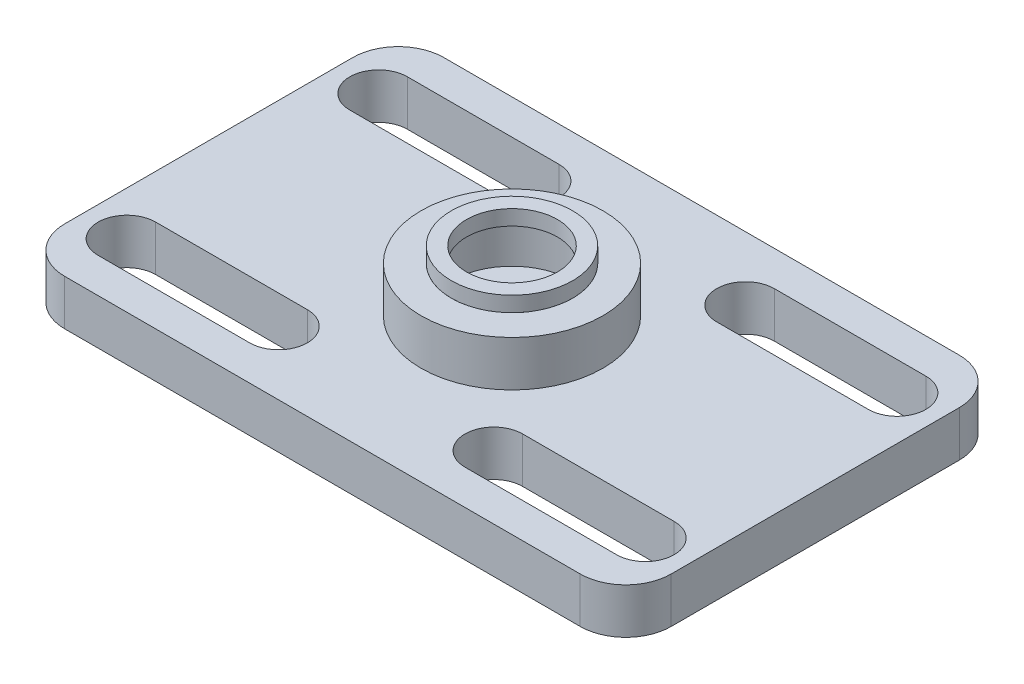
ISO-10303-21;
HEADER;
FILE_DESCRIPTION(('STEP AP214'),'2;1');
FILE_NAME('part.step','',(''),(''),'','','');
FILE_SCHEMA(('AUTOMOTIVE_DESIGN { 1 0 10303 214 1 1 1 1 }'));
ENDSEC;
DATA;
#1=APPLICATION_CONTEXT('core data for automotive mechanical design processes');
#2=APPLICATION_PROTOCOL_DEFINITION('international standard','automotive_design',2000,#1);
#3=PRODUCT_CONTEXT('',#1,'mechanical');
#4=PRODUCT('Part','Part','',(#3));
#5=PRODUCT_RELATED_PRODUCT_CATEGORY('part','',(#4));
#6=PRODUCT_DEFINITION_FORMATION('','',#4);
#7=PRODUCT_DEFINITION_CONTEXT('part definition',#1,'design');
#8=PRODUCT_DEFINITION('design','',#6,#7);
#9=PRODUCT_DEFINITION_SHAPE('','',#8);
#10=(LENGTH_UNIT() NAMED_UNIT(*) SI_UNIT(.MILLI.,.METRE.));
#11=(NAMED_UNIT(*) PLANE_ANGLE_UNIT() SI_UNIT($,.RADIAN.));
#12=(NAMED_UNIT(*) SI_UNIT($,.STERADIAN.) SOLID_ANGLE_UNIT());
#13=UNCERTAINTY_MEASURE_WITH_UNIT(LENGTH_MEASURE(1.E-05),#10,'distance_accuracy_value','');
#14=(GEOMETRIC_REPRESENTATION_CONTEXT(3) GLOBAL_UNCERTAINTY_ASSIGNED_CONTEXT((#13)) GLOBAL_UNIT_ASSIGNED_CONTEXT((#10,
#11,#12)) REPRESENTATION_CONTEXT('',''));
#15=CARTESIAN_POINT('',(0.,0.,0.));
#16=DIRECTION('',(0.,0.,1.));
#17=DIRECTION('',(1.,0.,0.));
#18=AXIS2_PLACEMENT_3D('',#15,#16,#17);
#19=CARTESIAN_POINT('',(0.,-35.,0.));
#20=DIRECTION('',(0.,-1.,0.));
#21=DIRECTION('',(0.,0.,-1.));
#22=AXIS2_PLACEMENT_3D('',#19,#20,#21);
#23=PLANE('',#22);
#24=CARTESIAN_POINT('',(85.5,-35.,-41.5));
#25=DIRECTION('',(0.,1.,0.));
#26=DIRECTION('',(0.,0.,-1.));
#27=AXIS2_PLACEMENT_3D('',#24,#25,#26);
#28=CIRCLE('',#27,9.5);
#29=CARTESIAN_POINT('',(85.5,-35.,-32.));
#30=VERTEX_POINT('',#29);
#31=CARTESIAN_POINT('',(85.5,-35.,-51.));
#32=VERTEX_POINT('',#31);
#33=EDGE_CURVE('E213',#30,#32,#28,.T.);
#34=ORIENTED_EDGE('',*,*,#33,.T.);
#35=DIRECTION('',(-1.,0.,0.));
#36=VECTOR('',#35,1.);
#37=CARTESIAN_POINT('',(85.5,-35.,-51.));
#38=LINE('',#37,#36);
#39=CARTESIAN_POINT('',(35.5,-35.,-51.));
#40=VERTEX_POINT('',#39);
#41=EDGE_CURVE('E223',#32,#40,#38,.T.);
#42=ORIENTED_EDGE('',*,*,#41,.T.);
#43=CARTESIAN_POINT('',(35.5,-35.,-41.5));
#44=DIRECTION('',(0.,1.,0.));
#45=DIRECTION('',(0.,0.,-1.));
#46=AXIS2_PLACEMENT_3D('',#43,#44,#45);
#47=CIRCLE('',#46,9.5);
#48=CARTESIAN_POINT('',(35.5,-35.,-32.));
#49=VERTEX_POINT('',#48);
#50=EDGE_CURVE('E64',#40,#49,#47,.T.);
#51=ORIENTED_EDGE('',*,*,#50,.T.);
#52=DIRECTION('',(-1.,0.,0.));
#53=VECTOR('',#52,1.);
#54=CARTESIAN_POINT('',(85.5,-35.,-32.));
#55=LINE('',#54,#53);
#56=EDGE_CURVE('E220',#30,#49,#55,.T.);
#57=ORIENTED_EDGE('',*,*,#56,.F.);
#58=EDGE_LOOP('',(#34,#42,#51,#57));
#59=FACE_BOUND('',#58,.T.);
#60=CARTESIAN_POINT('',(-85.5,-35.,41.5));
#61=DIRECTION('',(0.,1.,0.));
#62=DIRECTION('',(0.,0.,1.));
#63=AXIS2_PLACEMENT_3D('',#60,#61,#62);
#64=CIRCLE('',#63,9.5);
#65=CARTESIAN_POINT('',(-85.5,-35.,32.));
#66=VERTEX_POINT('',#65);
#67=CARTESIAN_POINT('',(-85.5,-35.,51.));
#68=VERTEX_POINT('',#67);
#69=EDGE_CURVE('E346',#66,#68,#64,.T.);
#70=ORIENTED_EDGE('',*,*,#69,.T.);
#71=DIRECTION('',(1.,0.,0.));
#72=VECTOR('',#71,1.);
#73=CARTESIAN_POINT('',(-85.5,-35.,51.));
#74=LINE('',#73,#72);
#75=CARTESIAN_POINT('',(-35.5,-35.,51.));
#76=VERTEX_POINT('',#75);
#77=EDGE_CURVE('E350',#68,#76,#74,.T.);
#78=ORIENTED_EDGE('',*,*,#77,.T.);
#79=CARTESIAN_POINT('',(-35.5,-35.,41.5));
#80=DIRECTION('',(0.,1.,0.));
#81=DIRECTION('',(0.,0.,1.));
#82=AXIS2_PLACEMENT_3D('',#79,#80,#81);
#83=CIRCLE('',#82,9.5);
#84=CARTESIAN_POINT('',(-35.5,-35.,32.));
#85=VERTEX_POINT('',#84);
#86=EDGE_CURVE('E355',#76,#85,#83,.T.);
#87=ORIENTED_EDGE('',*,*,#86,.T.);
#88=DIRECTION('',(1.,0.,0.));
#89=VECTOR('',#88,1.);
#90=CARTESIAN_POINT('',(-85.5,-35.,32.));
#91=LINE('',#90,#89);
#92=EDGE_CURVE('E359',#66,#85,#91,.T.);
#93=ORIENTED_EDGE('',*,*,#92,.F.);
#94=EDGE_LOOP('',(#70,#78,#87,#93));
#95=FACE_BOUND('',#94,.T.);
#96=DIRECTION('',(0.,0.,-1.));
#97=VECTOR('',#96,1.);
#98=CARTESIAN_POINT('',(-100.,-35.,62.5));
#99=LINE('',#98,#97);
#100=CARTESIAN_POINT('',(-100.,-35.,47.5));
#101=VERTEX_POINT('',#100);
#102=CARTESIAN_POINT('',(-100.,-35.,-47.5));
#103=VERTEX_POINT('',#102);
#104=EDGE_CURVE('E398',#101,#103,#99,.T.);
#105=ORIENTED_EDGE('',*,*,#104,.T.);
#106=CARTESIAN_POINT('',(-85.,-35.,-47.5));
#107=DIRECTION('',(0.,-1.,0.));
#108=DIRECTION('',(0.,0.,-1.));
#109=AXIS2_PLACEMENT_3D('',#106,#107,#108);
#110=CIRCLE('',#109,15.);
#111=CARTESIAN_POINT('',(-85.,-35.,-62.5));
#112=VERTEX_POINT('',#111);
#113=EDGE_CURVE('E471',#103,#112,#110,.T.);
#114=ORIENTED_EDGE('',*,*,#113,.T.);
#115=DIRECTION('',(1.,0.,0.));
#116=VECTOR('',#115,1.);
#117=CARTESIAN_POINT('',(-100.,-35.,-62.5));
#118=LINE('',#117,#116);
#119=CARTESIAN_POINT('',(85.,-35.,-62.5));
#120=VERTEX_POINT('',#119);
#121=EDGE_CURVE('E402',#112,#120,#118,.T.);
#122=ORIENTED_EDGE('',*,*,#121,.T.);
#123=CARTESIAN_POINT('',(85.,-35.,-47.5));
#124=DIRECTION('',(0.,-1.,0.));
#125=DIRECTION('',(0.,0.,-1.));
#126=AXIS2_PLACEMENT_3D('',#123,#124,#125);
#127=CIRCLE('',#126,15.);
#128=CARTESIAN_POINT('',(100.,-35.,-47.5));
#129=VERTEX_POINT('',#128);
#130=EDGE_CURVE('E465',#120,#129,#127,.T.);
#131=ORIENTED_EDGE('',*,*,#130,.T.);
#132=DIRECTION('',(0.,0.,1.));
#133=VECTOR('',#132,1.);
#134=CARTESIAN_POINT('',(100.,-35.,62.5));
#135=LINE('',#134,#133);
#136=CARTESIAN_POINT('',(100.,-35.,47.5));
#137=VERTEX_POINT('',#136);
#138=EDGE_CURVE('E389',#129,#137,#135,.T.);
#139=ORIENTED_EDGE('',*,*,#138,.T.);
#140=CARTESIAN_POINT('',(85.,-35.,47.5));
#141=DIRECTION('',(0.,-1.,0.));
#142=DIRECTION('',(0.,0.,-1.));
#143=AXIS2_PLACEMENT_3D('',#140,#141,#142);
#144=CIRCLE('',#143,15.);
#145=CARTESIAN_POINT('',(85.,-35.,62.5));
#146=VERTEX_POINT('',#145);
#147=EDGE_CURVE('E462',#137,#146,#144,.T.);
#148=ORIENTED_EDGE('',*,*,#147,.T.);
#149=DIRECTION('',(-1.,0.,0.));
#150=VECTOR('',#149,1.);
#151=CARTESIAN_POINT('',(-100.,-35.,62.5));
#152=LINE('',#151,#150);
#153=CARTESIAN_POINT('',(-85.,-35.,62.5));
#154=VERTEX_POINT('',#153);
#155=EDGE_CURVE('E393',#146,#154,#152,.T.);
#156=ORIENTED_EDGE('',*,*,#155,.T.);
#157=CARTESIAN_POINT('',(-85.,-35.,47.5));
#158=DIRECTION('',(0.,-1.,0.));
#159=DIRECTION('',(0.,0.,-1.));
#160=AXIS2_PLACEMENT_3D('',#157,#158,#159);
#161=CIRCLE('',#160,15.);
#162=EDGE_CURVE('E468',#154,#101,#161,.T.);
#163=ORIENTED_EDGE('',*,*,#162,.T.);
#164=EDGE_LOOP('',(#105,#114,#122,#131,#139,#148,#156,#163));
#165=FACE_BOUND('',#164,.T.);
#166=DIRECTION('',(1.,0.,0.));
#167=VECTOR('',#166,1.);
#168=CARTESIAN_POINT('',(-85.5,-35.,-51.));
#169=LINE('',#168,#167);
#170=CARTESIAN_POINT('',(-85.5,-35.,-51.));
#171=VERTEX_POINT('',#170);
#172=CARTESIAN_POINT('',(-35.5,-35.,-51.));
#173=VERTEX_POINT('',#172);
#174=EDGE_CURVE('E314',#171,#173,#169,.T.);
#175=ORIENTED_EDGE('',*,*,#174,.F.);
#176=CARTESIAN_POINT('',(-85.5,-35.,-41.5));
#177=DIRECTION('',(0.,-1.,0.));
#178=DIRECTION('',(0.,0.,-1.));
#179=AXIS2_PLACEMENT_3D('',#176,#177,#178);
#180=CIRCLE('',#179,9.5);
#181=CARTESIAN_POINT('',(-85.5,-35.,-32.));
#182=VERTEX_POINT('',#181);
#183=EDGE_CURVE('E302',#182,#171,#180,.T.);
#184=ORIENTED_EDGE('',*,*,#183,.F.);
#185=DIRECTION('',(1.,0.,0.));
#186=VECTOR('',#185,1.);
#187=CARTESIAN_POINT('',(-85.5,-35.,-32.));
#188=LINE('',#187,#186);
#189=CARTESIAN_POINT('',(-35.5,-35.,-32.));
#190=VERTEX_POINT('',#189);
#191=EDGE_CURVE('E305',#182,#190,#188,.T.);
#192=ORIENTED_EDGE('',*,*,#191,.T.);
#193=CARTESIAN_POINT('',(-35.5,-35.,-41.5));
#194=DIRECTION('',(0.,-1.,0.));
#195=DIRECTION('',(0.,0.,-1.));
#196=AXIS2_PLACEMENT_3D('',#193,#194,#195);
#197=CIRCLE('',#196,9.5);
#198=EDGE_CURVE('E310',#173,#190,#197,.T.);
#199=ORIENTED_EDGE('',*,*,#198,.F.);
#200=EDGE_LOOP('',(#175,#184,#192,#199));
#201=FACE_BOUND('',#200,.T.);
#202=DIRECTION('',(-1.,0.,0.));
#203=VECTOR('',#202,1.);
#204=CARTESIAN_POINT('',(85.5,-35.,51.));
#205=LINE('',#204,#203);
#206=CARTESIAN_POINT('',(85.5,-35.,51.));
#207=VERTEX_POINT('',#206);
#208=CARTESIAN_POINT('',(35.5,-35.,51.));
#209=VERTEX_POINT('',#208);
#210=EDGE_CURVE('E270',#207,#209,#205,.T.);
#211=ORIENTED_EDGE('',*,*,#210,.F.);
#212=CARTESIAN_POINT('',(85.5,-35.,41.5));
#213=DIRECTION('',(0.,-1.,0.));
#214=DIRECTION('',(0.,0.,1.));
#215=AXIS2_PLACEMENT_3D('',#212,#213,#214);
#216=CIRCLE('',#215,9.5);
#217=CARTESIAN_POINT('',(85.5,-35.,32.));
#218=VERTEX_POINT('',#217);
#219=EDGE_CURVE('E258',#218,#207,#216,.T.);
#220=ORIENTED_EDGE('',*,*,#219,.F.);
#221=DIRECTION('',(-1.,0.,0.));
#222=VECTOR('',#221,1.);
#223=CARTESIAN_POINT('',(85.5,-35.,32.));
#224=LINE('',#223,#222);
#225=CARTESIAN_POINT('',(35.5,-35.,32.));
#226=VERTEX_POINT('',#225);
#227=EDGE_CURVE('E261',#218,#226,#224,.T.);
#228=ORIENTED_EDGE('',*,*,#227,.T.);
#229=CARTESIAN_POINT('',(35.5,-35.,41.5));
#230=DIRECTION('',(0.,-1.,0.));
#231=DIRECTION('',(0.,0.,1.));
#232=AXIS2_PLACEMENT_3D('',#229,#230,#231);
#233=CIRCLE('',#232,9.5);
#234=EDGE_CURVE('E266',#209,#226,#233,.T.);
#235=ORIENTED_EDGE('',*,*,#234,.F.);
#236=EDGE_LOOP('',(#211,#220,#228,#235));
#237=FACE_BOUND('',#236,.T.);
#238=ADVANCED_FACE('F48',(#59,#95,#165,#201,#237),#23,.T.);
#239=CARTESIAN_POINT('',(0.,-20.,0.));
#240=DIRECTION('',(0.,-1.,0.));
#241=DIRECTION('',(0.,0.,-1.));
#242=AXIS2_PLACEMENT_3D('',#239,#240,#241);
#243=PLANE('',#242);
#244=DIRECTION('',(-1.,0.,0.));
#245=VECTOR('',#244,1.);
#246=CARTESIAN_POINT('',(85.5,-20.,-51.));
#247=LINE('',#246,#245);
#248=CARTESIAN_POINT('',(85.5,-20.,-51.));
#249=VERTEX_POINT('',#248);
#250=CARTESIAN_POINT('',(35.5,-20.,-51.));
#251=VERTEX_POINT('',#250);
#252=EDGE_CURVE('E243',#249,#251,#247,.T.);
#253=ORIENTED_EDGE('',*,*,#252,.F.);
#254=CARTESIAN_POINT('',(85.5,-20.,-41.5));
#255=DIRECTION('',(0.,1.,0.));
#256=DIRECTION('',(0.,0.,-1.));
#257=AXIS2_PLACEMENT_3D('',#254,#255,#256);
#258=CIRCLE('',#257,9.5);
#259=CARTESIAN_POINT('',(85.5,-20.,-32.));
#260=VERTEX_POINT('',#259);
#261=EDGE_CURVE('E72',#260,#249,#258,.T.);
#262=ORIENTED_EDGE('',*,*,#261,.F.);
#263=DIRECTION('',(-1.,0.,0.));
#264=VECTOR('',#263,1.);
#265=CARTESIAN_POINT('',(85.5,-20.,-32.));
#266=LINE('',#265,#264);
#267=CARTESIAN_POINT('',(35.5,-20.,-32.));
#268=VERTEX_POINT('',#267);
#269=EDGE_CURVE('E230',#260,#268,#266,.T.);
#270=ORIENTED_EDGE('',*,*,#269,.T.);
#271=CARTESIAN_POINT('',(35.5,-20.,-41.5));
#272=DIRECTION('',(0.,1.,0.));
#273=DIRECTION('',(0.,0.,-1.));
#274=AXIS2_PLACEMENT_3D('',#271,#272,#273);
#275=CIRCLE('',#274,9.5);
#276=EDGE_CURVE('E234',#251,#268,#275,.T.);
#277=ORIENTED_EDGE('',*,*,#276,.F.);
#278=EDGE_LOOP('',(#253,#262,#270,#277));
#279=FACE_BOUND('',#278,.T.);
#280=CARTESIAN_POINT('',(-85.5,-20.,-41.5));
#281=DIRECTION('',(0.,-1.,0.));
#282=DIRECTION('',(0.,0.,-1.));
#283=AXIS2_PLACEMENT_3D('',#280,#281,#282);
#284=CIRCLE('',#283,9.5);
#285=CARTESIAN_POINT('',(-85.5,-20.,-32.));
#286=VERTEX_POINT('',#285);
#287=CARTESIAN_POINT('',(-85.5,-20.,-51.));
#288=VERTEX_POINT('',#287);
#289=EDGE_CURVE('E292',#286,#288,#284,.T.);
#290=ORIENTED_EDGE('',*,*,#289,.T.);
#291=DIRECTION('',(1.,0.,0.));
#292=VECTOR('',#291,1.);
#293=CARTESIAN_POINT('',(-85.5,-20.,-51.));
#294=LINE('',#293,#292);
#295=CARTESIAN_POINT('',(-35.5,-20.,-51.));
#296=VERTEX_POINT('',#295);
#297=EDGE_CURVE('E306',#288,#296,#294,.T.);
#298=ORIENTED_EDGE('',*,*,#297,.T.);
#299=CARTESIAN_POINT('',(-35.5,-20.,-41.5));
#300=DIRECTION('',(0.,-1.,0.));
#301=DIRECTION('',(0.,0.,-1.));
#302=AXIS2_PLACEMENT_3D('',#299,#300,#301);
#303=CIRCLE('',#302,9.5);
#304=CARTESIAN_POINT('',(-35.5,-20.,-32.));
#305=VERTEX_POINT('',#304);
#306=EDGE_CURVE('E325',#296,#305,#303,.T.);
#307=ORIENTED_EDGE('',*,*,#306,.T.);
#308=DIRECTION('',(1.,0.,0.));
#309=VECTOR('',#308,1.);
#310=CARTESIAN_POINT('',(-85.5,-20.,-32.));
#311=LINE('',#310,#309);
#312=EDGE_CURVE('E321',#286,#305,#311,.T.);
#313=ORIENTED_EDGE('',*,*,#312,.F.);
#314=EDGE_LOOP('',(#290,#298,#307,#313));
#315=FACE_BOUND('',#314,.T.);
#316=DIRECTION('',(1.,0.,0.));
#317=VECTOR('',#316,1.);
#318=CARTESIAN_POINT('',(-85.5,-20.,51.));
#319=LINE('',#318,#317);
#320=CARTESIAN_POINT('',(-85.5,-20.,51.));
#321=VERTEX_POINT('',#320);
#322=CARTESIAN_POINT('',(-35.5,-20.,51.));
#323=VERTEX_POINT('',#322);
#324=EDGE_CURVE('E365',#321,#323,#319,.T.);
#325=ORIENTED_EDGE('',*,*,#324,.F.);
#326=CARTESIAN_POINT('',(-85.5,-20.,41.5));
#327=DIRECTION('',(0.,1.,0.));
#328=DIRECTION('',(0.,0.,1.));
#329=AXIS2_PLACEMENT_3D('',#326,#327,#328);
#330=CIRCLE('',#329,9.5);
#331=CARTESIAN_POINT('',(-85.5,-20.,32.));
#332=VERTEX_POINT('',#331);
#333=EDGE_CURVE('E336',#332,#321,#330,.T.);
#334=ORIENTED_EDGE('',*,*,#333,.F.);
#335=DIRECTION('',(1.,0.,0.));
#336=VECTOR('',#335,1.);
#337=CARTESIAN_POINT('',(-85.5,-20.,32.));
#338=LINE('',#337,#336);
#339=CARTESIAN_POINT('',(-35.5,-20.,32.));
#340=VERTEX_POINT('',#339);
#341=EDGE_CURVE('E351',#332,#340,#338,.T.);
#342=ORIENTED_EDGE('',*,*,#341,.T.);
#343=CARTESIAN_POINT('',(-35.5,-20.,41.5));
#344=DIRECTION('',(0.,1.,0.));
#345=DIRECTION('',(0.,0.,1.));
#346=AXIS2_PLACEMENT_3D('',#343,#344,#345);
#347=CIRCLE('',#346,9.5);
#348=EDGE_CURVE('E369',#323,#340,#347,.T.);
#349=ORIENTED_EDGE('',*,*,#348,.F.);
#350=EDGE_LOOP('',(#325,#334,#342,#349));
#351=FACE_BOUND('',#350,.T.);
#352=CARTESIAN_POINT('',(0.,-20.,0.));
#353=DIRECTION('',(0.,-1.,0.));
#354=DIRECTION('',(0.,0.,-1.));
#355=AXIS2_PLACEMENT_3D('',#352,#353,#354);
#356=CIRCLE('',#355,30.);
#357=CARTESIAN_POINT('',(0.,-20.,-30.));
#358=VERTEX_POINT('',#357);
#359=EDGE_CURVE('E429',#358,#358,#356,.T.);
#360=ORIENTED_EDGE('',*,*,#359,.T.);
#361=EDGE_LOOP('',(#360));
#362=FACE_BOUND('',#361,.T.);
#363=DIRECTION('',(1.,0.,0.));
#364=VECTOR('',#363,1.);
#365=CARTESIAN_POINT('',(-100.,-20.,-62.5));
#366=LINE('',#365,#364);
#367=CARTESIAN_POINT('',(-85.,-20.,-62.5));
#368=VERTEX_POINT('',#367);
#369=CARTESIAN_POINT('',(85.,-20.,-62.5));
#370=VERTEX_POINT('',#369);
#371=EDGE_CURVE('E394',#368,#370,#366,.T.);
#372=ORIENTED_EDGE('',*,*,#371,.F.);
#373=CARTESIAN_POINT('',(-85.,-20.,-47.5));
#374=DIRECTION('',(0.,-1.,0.));
#375=DIRECTION('',(0.,0.,-1.));
#376=AXIS2_PLACEMENT_3D('',#373,#374,#375);
#377=CIRCLE('',#376,15.);
#378=CARTESIAN_POINT('',(-100.,-20.,-47.5));
#379=VERTEX_POINT('',#378);
#380=EDGE_CURVE('E452',#368,#379,#377,.F.);
#381=ORIENTED_EDGE('',*,*,#380,.T.);
#382=DIRECTION('',(0.,0.,-1.));
#383=VECTOR('',#382,1.);
#384=CARTESIAN_POINT('',(-100.,-20.,62.5));
#385=LINE('',#384,#383);
#386=CARTESIAN_POINT('',(-100.,-20.,47.5));
#387=VERTEX_POINT('',#386);
#388=EDGE_CURVE('E414',#387,#379,#385,.T.);
#389=ORIENTED_EDGE('',*,*,#388,.F.);
#390=CARTESIAN_POINT('',(-85.,-20.,47.5));
#391=DIRECTION('',(0.,-1.,0.));
#392=DIRECTION('',(0.,0.,-1.));
#393=AXIS2_PLACEMENT_3D('',#390,#391,#392);
#394=CIRCLE('',#393,15.);
#395=CARTESIAN_POINT('',(-85.,-20.,62.5));
#396=VERTEX_POINT('',#395);
#397=EDGE_CURVE('E449',#387,#396,#394,.F.);
#398=ORIENTED_EDGE('',*,*,#397,.T.);
#399=DIRECTION('',(-1.,0.,0.));
#400=VECTOR('',#399,1.);
#401=CARTESIAN_POINT('',(-100.,-20.,62.5));
#402=LINE('',#401,#400);
#403=CARTESIAN_POINT('',(85.,-20.,62.5));
#404=VERTEX_POINT('',#403);
#405=EDGE_CURVE('E410',#404,#396,#402,.T.);
#406=ORIENTED_EDGE('',*,*,#405,.F.);
#407=CARTESIAN_POINT('',(85.,-20.,47.5));
#408=DIRECTION('',(0.,-1.,0.));
#409=DIRECTION('',(0.,0.,-1.));
#410=AXIS2_PLACEMENT_3D('',#407,#408,#409);
#411=CIRCLE('',#410,15.);
#412=CARTESIAN_POINT('',(100.,-20.,47.5));
#413=VERTEX_POINT('',#412);
#414=EDGE_CURVE('E443',#404,#413,#411,.F.);
#415=ORIENTED_EDGE('',*,*,#414,.T.);
#416=DIRECTION('',(0.,0.,1.));
#417=VECTOR('',#416,1.);
#418=CARTESIAN_POINT('',(100.,-20.,62.5));
#419=LINE('',#418,#417);
#420=CARTESIAN_POINT('',(100.,-20.,-47.5));
#421=VERTEX_POINT('',#420);
#422=EDGE_CURVE('E379',#421,#413,#419,.T.);
#423=ORIENTED_EDGE('',*,*,#422,.F.);
#424=CARTESIAN_POINT('',(85.,-20.,-47.5));
#425=DIRECTION('',(0.,-1.,0.));
#426=DIRECTION('',(0.,0.,-1.));
#427=AXIS2_PLACEMENT_3D('',#424,#425,#426);
#428=CIRCLE('',#427,15.);
#429=EDGE_CURVE('E446',#421,#370,#428,.F.);
#430=ORIENTED_EDGE('',*,*,#429,.T.);
#431=EDGE_LOOP('',(#372,#381,#389,#398,#406,#415,#423,#430));
#432=FACE_BOUND('',#431,.T.);
#433=CARTESIAN_POINT('',(85.5,-20.,41.5));
#434=DIRECTION('',(0.,-1.,0.));
#435=DIRECTION('',(0.,0.,1.));
#436=AXIS2_PLACEMENT_3D('',#433,#434,#435);
#437=CIRCLE('',#436,9.5);
#438=CARTESIAN_POINT('',(85.5,-20.,32.));
#439=VERTEX_POINT('',#438);
#440=CARTESIAN_POINT('',(85.5,-20.,51.));
#441=VERTEX_POINT('',#440);
#442=EDGE_CURVE('E252',#439,#441,#437,.T.);
#443=ORIENTED_EDGE('',*,*,#442,.T.);
#444=DIRECTION('',(-1.,0.,0.));
#445=VECTOR('',#444,1.);
#446=CARTESIAN_POINT('',(85.5,-20.,51.));
#447=LINE('',#446,#445);
#448=CARTESIAN_POINT('',(35.5,-20.,51.));
#449=VERTEX_POINT('',#448);
#450=EDGE_CURVE('E262',#441,#449,#447,.T.);
#451=ORIENTED_EDGE('',*,*,#450,.T.);
#452=CARTESIAN_POINT('',(35.5,-20.,41.5));
#453=DIRECTION('',(0.,-1.,0.));
#454=DIRECTION('',(0.,0.,1.));
#455=AXIS2_PLACEMENT_3D('',#452,#453,#454);
#456=CIRCLE('',#455,9.5);
#457=CARTESIAN_POINT('',(35.5,-20.,32.));
#458=VERTEX_POINT('',#457);
#459=EDGE_CURVE('E281',#449,#458,#456,.T.);
#460=ORIENTED_EDGE('',*,*,#459,.T.);
#461=DIRECTION('',(-1.,0.,0.));
#462=VECTOR('',#461,1.);
#463=CARTESIAN_POINT('',(85.5,-20.,32.));
#464=LINE('',#463,#462);
#465=EDGE_CURVE('E277',#439,#458,#464,.T.);
#466=ORIENTED_EDGE('',*,*,#465,.F.);
#467=EDGE_LOOP('',(#443,#451,#460,#466));
#468=FACE_BOUND('',#467,.T.);
#469=ADVANCED_FACE('F500',(#279,#315,#351,#362,#432,#468),#243,.F.);
#470=CARTESIAN_POINT('',(0.,-5.,0.));
#471=DIRECTION('',(0.,-1.,0.));
#472=DIRECTION('',(0.,0.,-1.));
#473=AXIS2_PLACEMENT_3D('',#470,#471,#472);
#474=PLANE('',#473);
#475=CARTESIAN_POINT('',(0.,-5.,0.));
#476=DIRECTION('',(0.,-1.,0.));
#477=DIRECTION('',(0.,0.,-1.));
#478=AXIS2_PLACEMENT_3D('',#475,#476,#477);
#479=CIRCLE('',#478,30.);
#480=CARTESIAN_POINT('',(0.,-5.,-30.));
#481=VERTEX_POINT('',#480);
#482=EDGE_CURVE('E428',#481,#481,#479,.T.);
#483=ORIENTED_EDGE('',*,*,#482,.F.);
#484=EDGE_LOOP('',(#483));
#485=FACE_BOUND('',#484,.T.);
#486=CARTESIAN_POINT('',(0.,-5.,0.));
#487=DIRECTION('',(0.,-1.,0.));
#488=DIRECTION('',(0.,0.,-1.));
#489=AXIS2_PLACEMENT_3D('',#486,#487,#488);
#490=CIRCLE('',#489,20.);
#491=CARTESIAN_POINT('',(0.,-5.,-20.));
#492=VERTEX_POINT('',#491);
#493=EDGE_CURVE('E424',#492,#492,#490,.T.);
#494=ORIENTED_EDGE('',*,*,#493,.T.);
#495=EDGE_LOOP('',(#494));
#496=FACE_BOUND('',#495,.T.);
#497=ADVANCED_FACE('F534',(#485,#496),#474,.F.);
#498=CARTESIAN_POINT('',(0.,-20.,0.));
#499=DIRECTION('',(0.,1.,0.));
#500=DIRECTION('',(0.,0.,1.));
#501=AXIS2_PLACEMENT_3D('',#498,#499,#500);
#502=CYLINDRICAL_SURFACE('',#501,30.);
#503=ORIENTED_EDGE('',*,*,#359,.F.);
#504=EDGE_LOOP('',(#503));
#505=FACE_BOUND('',#504,.T.);
#506=ORIENTED_EDGE('',*,*,#482,.T.);
#507=EDGE_LOOP('',(#506));
#508=FACE_BOUND('',#507,.T.);
#509=ADVANCED_FACE('F552',(#505,#508),#502,.T.);
#510=CARTESIAN_POINT('',(0.,-20.,0.));
#511=DIRECTION('',(0.,1.,0.));
#512=DIRECTION('',(0.,0.,1.));
#513=AXIS2_PLACEMENT_3D('',#510,#511,#512);
#514=CYLINDRICAL_SURFACE('',#513,20.);
#515=CARTESIAN_POINT('',(0.,-20.,0.));
#516=DIRECTION('',(0.,-1.,0.));
#517=DIRECTION('',(0.,0.,-1.));
#518=AXIS2_PLACEMENT_3D('',#515,#516,#517);
#519=CIRCLE('',#518,20.);
#520=CARTESIAN_POINT('',(0.,-20.,-20.));
#521=VERTEX_POINT('',#520);
#522=EDGE_CURVE('E406',#521,#521,#519,.T.);
#523=ORIENTED_EDGE('',*,*,#522,.T.);
#524=EDGE_LOOP('',(#523));
#525=FACE_BOUND('',#524,.T.);
#526=ORIENTED_EDGE('',*,*,#493,.F.);
#527=EDGE_LOOP('',(#526));
#528=FACE_BOUND('',#527,.T.);
#529=ADVANCED_FACE('F549',(#525,#528),#514,.F.);
#530=ORIENTED_EDGE('',*,*,#522,.F.);
#531=EDGE_LOOP('',(#530));
#532=FACE_BOUND('',#531,.T.);
#533=ADVANCED_FACE('F537',(#532),#243,.F.);
#534=CARTESIAN_POINT('',(100.,-35.,62.5));
#535=DIRECTION('',(-1.,0.,0.));
#536=DIRECTION('',(0.,0.,1.));
#537=AXIS2_PLACEMENT_3D('',#534,#535,#536);
#538=PLANE('',#537);
#539=ORIENTED_EDGE('',*,*,#138,.F.);
#540=DIRECTION('',(0.,1.,0.));
#541=VECTOR('',#540,1.);
#542=CARTESIAN_POINT('',(100.,-35.,-47.5));
#543=LINE('',#542,#541);
#544=EDGE_CURVE('E12',#129,#421,#543,.T.);
#545=ORIENTED_EDGE('',*,*,#544,.T.);
#546=ORIENTED_EDGE('',*,*,#422,.T.);
#547=DIRECTION('',(0.,1.,0.));
#548=VECTOR('',#547,1.);
#549=CARTESIAN_POINT('',(100.,-35.,47.5));
#550=LINE('',#549,#548);
#551=EDGE_CURVE('E57',#413,#137,#550,.F.);
#552=ORIENTED_EDGE('',*,*,#551,.T.);
#553=EDGE_LOOP('',(#539,#545,#546,#552));
#554=FACE_BOUND('',#553,.T.);
#555=ADVANCED_FACE('F484',(#554),#538,.F.);
#556=CARTESIAN_POINT('',(-100.,-35.,62.5));
#557=DIRECTION('',(0.,0.,-1.));
#558=DIRECTION('',(-1.,0.,0.));
#559=AXIS2_PLACEMENT_3D('',#556,#557,#558);
#560=PLANE('',#559);
#561=ORIENTED_EDGE('',*,*,#405,.T.);
#562=DIRECTION('',(0.,1.,0.));
#563=VECTOR('',#562,1.);
#564=CARTESIAN_POINT('',(-85.,-35.,62.5));
#565=LINE('',#564,#563);
#566=EDGE_CURVE('E478',#396,#154,#565,.F.);
#567=ORIENTED_EDGE('',*,*,#566,.T.);
#568=ORIENTED_EDGE('',*,*,#155,.F.);
#569=DIRECTION('',(0.,1.,0.));
#570=VECTOR('',#569,1.);
#571=CARTESIAN_POINT('',(85.,-35.,62.5));
#572=LINE('',#571,#570);
#573=EDGE_CURVE('E474',#146,#404,#572,.T.);
#574=ORIENTED_EDGE('',*,*,#573,.T.);
#575=EDGE_LOOP('',(#561,#567,#568,#574));
#576=FACE_BOUND('',#575,.T.);
#577=ADVANCED_FACE('F496',(#576),#560,.F.);
#578=CARTESIAN_POINT('',(-100.,-35.,62.5));
#579=DIRECTION('',(1.,0.,0.));
#580=DIRECTION('',(0.,0.,-1.));
#581=AXIS2_PLACEMENT_3D('',#578,#579,#580);
#582=PLANE('',#581);
#583=ORIENTED_EDGE('',*,*,#388,.T.);
#584=DIRECTION('',(0.,1.,0.));
#585=VECTOR('',#584,1.);
#586=CARTESIAN_POINT('',(-100.,-35.,-47.5));
#587=LINE('',#586,#585);
#588=EDGE_CURVE('E459',#379,#103,#587,.F.);
#589=ORIENTED_EDGE('',*,*,#588,.T.);
#590=ORIENTED_EDGE('',*,*,#104,.F.);
#591=DIRECTION('',(0.,1.,0.));
#592=VECTOR('',#591,1.);
#593=CARTESIAN_POINT('',(-100.,-35.,47.5));
#594=LINE('',#593,#592);
#595=EDGE_CURVE('E455',#101,#387,#594,.T.);
#596=ORIENTED_EDGE('',*,*,#595,.T.);
#597=EDGE_LOOP('',(#583,#589,#590,#596));
#598=FACE_BOUND('',#597,.T.);
#599=ADVANCED_FACE('F509',(#598),#582,.F.);
#600=CARTESIAN_POINT('',(-100.,-35.,-62.5));
#601=DIRECTION('',(0.,0.,1.));
#602=DIRECTION('',(1.,0.,0.));
#603=AXIS2_PLACEMENT_3D('',#600,#601,#602);
#604=PLANE('',#603);
#605=ORIENTED_EDGE('',*,*,#121,.F.);
#606=DIRECTION('',(0.,1.,0.));
#607=VECTOR('',#606,1.);
#608=CARTESIAN_POINT('',(-85.,-35.,-62.5));
#609=LINE('',#608,#607);
#610=EDGE_CURVE('E439',#112,#368,#609,.T.);
#611=ORIENTED_EDGE('',*,*,#610,.T.);
#612=ORIENTED_EDGE('',*,*,#371,.T.);
#613=DIRECTION('',(0.,1.,0.));
#614=VECTOR('',#613,1.);
#615=CARTESIAN_POINT('',(85.,-35.,-62.5));
#616=LINE('',#615,#614);
#617=EDGE_CURVE('E433',#370,#120,#616,.F.);
#618=ORIENTED_EDGE('',*,*,#617,.T.);
#619=EDGE_LOOP('',(#605,#611,#612,#618));
#620=FACE_BOUND('',#619,.T.);
#621=ADVANCED_FACE('F517',(#620),#604,.F.);
#622=CARTESIAN_POINT('',(-85.,-35.,-47.5));
#623=DIRECTION('',(0.,1.,0.));
#624=DIRECTION('',(0.,0.,1.));
#625=AXIS2_PLACEMENT_3D('',#622,#623,#624);
#626=CYLINDRICAL_SURFACE('',#625,15.);
#627=ORIENTED_EDGE('',*,*,#113,.F.);
#628=ORIENTED_EDGE('',*,*,#588,.F.);
#629=ORIENTED_EDGE('',*,*,#380,.F.);
#630=ORIENTED_EDGE('',*,*,#610,.F.);
#631=EDGE_LOOP('',(#627,#628,#629,#630));
#632=FACE_BOUND('',#631,.T.);
#633=ADVANCED_FACE('F515',(#632),#626,.T.);
#634=CARTESIAN_POINT('',(-85.,-35.,47.5));
#635=DIRECTION('',(0.,1.,0.));
#636=DIRECTION('',(0.,0.,1.));
#637=AXIS2_PLACEMENT_3D('',#634,#635,#636);
#638=CYLINDRICAL_SURFACE('',#637,15.);
#639=ORIENTED_EDGE('',*,*,#162,.F.);
#640=ORIENTED_EDGE('',*,*,#566,.F.);
#641=ORIENTED_EDGE('',*,*,#397,.F.);
#642=ORIENTED_EDGE('',*,*,#595,.F.);
#643=EDGE_LOOP('',(#639,#640,#641,#642));
#644=FACE_BOUND('',#643,.T.);
#645=ADVANCED_FACE('F506',(#644),#638,.T.);
#646=CARTESIAN_POINT('',(85.,-35.,-47.5));
#647=DIRECTION('',(0.,1.,0.));
#648=DIRECTION('',(0.,0.,1.));
#649=AXIS2_PLACEMENT_3D('',#646,#647,#648);
#650=CYLINDRICAL_SURFACE('',#649,15.);
#651=ORIENTED_EDGE('',*,*,#130,.F.);
#652=ORIENTED_EDGE('',*,*,#617,.F.);
#653=ORIENTED_EDGE('',*,*,#429,.F.);
#654=ORIENTED_EDGE('',*,*,#544,.F.);
#655=EDGE_LOOP('',(#651,#652,#653,#654));
#656=FACE_BOUND('',#655,.T.);
#657=ADVANCED_FACE('F520',(#656),#650,.T.);
#658=CARTESIAN_POINT('',(85.,-35.,47.5));
#659=DIRECTION('',(0.,1.,0.));
#660=DIRECTION('',(0.,0.,1.));
#661=AXIS2_PLACEMENT_3D('',#658,#659,#660);
#662=CYLINDRICAL_SURFACE('',#661,15.);
#663=ORIENTED_EDGE('',*,*,#147,.F.);
#664=ORIENTED_EDGE('',*,*,#551,.F.);
#665=ORIENTED_EDGE('',*,*,#414,.F.);
#666=ORIENTED_EDGE('',*,*,#573,.F.);
#667=EDGE_LOOP('',(#663,#664,#665,#666));
#668=FACE_BOUND('',#667,.T.);
#669=ADVANCED_FACE('F50',(#668),#662,.T.);
#670=CARTESIAN_POINT('',(-85.5,-35.,41.5));
#671=DIRECTION('',(0.,1.,0.));
#672=DIRECTION('',(0.,0.,1.));
#673=AXIS2_PLACEMENT_3D('',#670,#671,#672);
#674=CYLINDRICAL_SURFACE('',#673,9.5);
#675=ORIENTED_EDGE('',*,*,#333,.T.);
#676=DIRECTION('',(0.,1.,0.));
#677=VECTOR('',#676,1.);
#678=CARTESIAN_POINT('',(-85.5,-35.,51.));
#679=LINE('',#678,#677);
#680=EDGE_CURVE('E362',#68,#321,#679,.T.);
#681=ORIENTED_EDGE('',*,*,#680,.F.);
#682=ORIENTED_EDGE('',*,*,#69,.F.);
#683=DIRECTION('',(0.,1.,0.));
#684=VECTOR('',#683,1.);
#685=CARTESIAN_POINT('',(-85.5,-35.,32.));
#686=LINE('',#685,#684);
#687=EDGE_CURVE('E376',#66,#332,#686,.T.);
#688=ORIENTED_EDGE('',*,*,#687,.T.);
#689=EDGE_LOOP('',(#675,#681,#682,#688));
#690=FACE_BOUND('',#689,.T.);
#691=ADVANCED_FACE('F526',(#690),#674,.F.);
#692=CARTESIAN_POINT('',(-85.5,-35.,32.));
#693=DIRECTION('',(0.,0.,1.));
#694=DIRECTION('',(1.,0.,0.));
#695=AXIS2_PLACEMENT_3D('',#692,#693,#694);
#696=PLANE('',#695);
#697=ORIENTED_EDGE('',*,*,#341,.F.);
#698=ORIENTED_EDGE('',*,*,#687,.F.);
#699=ORIENTED_EDGE('',*,*,#92,.T.);
#700=DIRECTION('',(0.,1.,0.));
#701=VECTOR('',#700,1.);
#702=CARTESIAN_POINT('',(-35.5,-35.,32.));
#703=LINE('',#702,#701);
#704=EDGE_CURVE('E380',#85,#340,#703,.T.);
#705=ORIENTED_EDGE('',*,*,#704,.T.);
#706=EDGE_LOOP('',(#697,#698,#699,#705));
#707=FACE_BOUND('',#706,.T.);
#708=ADVANCED_FACE('F588',(#707),#696,.T.);
#709=CARTESIAN_POINT('',(-35.5,-35.,41.5));
#710=DIRECTION('',(0.,1.,0.));
#711=DIRECTION('',(0.,0.,1.));
#712=AXIS2_PLACEMENT_3D('',#709,#710,#711);
#713=CYLINDRICAL_SURFACE('',#712,9.5);
#714=ORIENTED_EDGE('',*,*,#348,.T.);
#715=ORIENTED_EDGE('',*,*,#704,.F.);
#716=ORIENTED_EDGE('',*,*,#86,.F.);
#717=DIRECTION('',(0.,1.,0.));
#718=VECTOR('',#717,1.);
#719=CARTESIAN_POINT('',(-35.5,-35.,51.));
#720=LINE('',#719,#718);
#721=EDGE_CURVE('E383',#76,#323,#720,.T.);
#722=ORIENTED_EDGE('',*,*,#721,.T.);
#723=EDGE_LOOP('',(#714,#715,#716,#722));
#724=FACE_BOUND('',#723,.T.);
#725=ADVANCED_FACE('F597',(#724),#713,.F.);
#726=CARTESIAN_POINT('',(-85.5,-35.,51.));
#727=DIRECTION('',(0.,0.,1.));
#728=DIRECTION('',(1.,0.,0.));
#729=AXIS2_PLACEMENT_3D('',#726,#727,#728);
#730=PLANE('',#729);
#731=ORIENTED_EDGE('',*,*,#324,.T.);
#732=ORIENTED_EDGE('',*,*,#721,.F.);
#733=ORIENTED_EDGE('',*,*,#77,.F.);
#734=ORIENTED_EDGE('',*,*,#680,.T.);
#735=EDGE_LOOP('',(#731,#732,#733,#734));
#736=FACE_BOUND('',#735,.T.);
#737=ADVANCED_FACE('F607',(#736),#730,.F.);
#738=CARTESIAN_POINT('',(-85.5,-35.,-41.5));
#739=DIRECTION('',(0.,1.,0.));
#740=DIRECTION('',(0.,0.,1.));
#741=AXIS2_PLACEMENT_3D('',#738,#739,#740);
#742=CYLINDRICAL_SURFACE('',#741,9.5);
#743=ORIENTED_EDGE('',*,*,#289,.F.);
#744=DIRECTION('',(0.,1.,0.));
#745=VECTOR('',#744,1.);
#746=CARTESIAN_POINT('',(-85.5,-35.,-32.));
#747=LINE('',#746,#745);
#748=EDGE_CURVE('E317',#182,#286,#747,.T.);
#749=ORIENTED_EDGE('',*,*,#748,.F.);
#750=ORIENTED_EDGE('',*,*,#183,.T.);
#751=DIRECTION('',(0.,1.,0.));
#752=VECTOR('',#751,1.);
#753=CARTESIAN_POINT('',(-85.5,-35.,-51.));
#754=LINE('',#753,#752);
#755=EDGE_CURVE('E332',#171,#288,#754,.T.);
#756=ORIENTED_EDGE('',*,*,#755,.T.);
#757=EDGE_LOOP('',(#743,#749,#750,#756));
#758=FACE_BOUND('',#757,.T.);
#759=ADVANCED_FACE('F617',(#758),#742,.F.);
#760=CARTESIAN_POINT('',(-85.5,-35.,-51.));
#761=DIRECTION('',(0.,0.,1.));
#762=DIRECTION('',(1.,0.,0.));
#763=AXIS2_PLACEMENT_3D('',#760,#761,#762);
#764=PLANE('',#763);
#765=ORIENTED_EDGE('',*,*,#297,.F.);
#766=ORIENTED_EDGE('',*,*,#755,.F.);
#767=ORIENTED_EDGE('',*,*,#174,.T.);
#768=DIRECTION('',(0.,1.,0.));
#769=VECTOR('',#768,1.);
#770=CARTESIAN_POINT('',(-35.5,-35.,-51.));
#771=LINE('',#770,#769);
#772=EDGE_CURVE('E337',#173,#296,#771,.T.);
#773=ORIENTED_EDGE('',*,*,#772,.T.);
#774=EDGE_LOOP('',(#765,#766,#767,#773));
#775=FACE_BOUND('',#774,.T.);
#776=ADVANCED_FACE('F627',(#775),#764,.T.);
#777=CARTESIAN_POINT('',(-35.5,-35.,-41.5));
#778=DIRECTION('',(0.,1.,0.));
#779=DIRECTION('',(0.,0.,1.));
#780=AXIS2_PLACEMENT_3D('',#777,#778,#779);
#781=CYLINDRICAL_SURFACE('',#780,9.5);
#782=ORIENTED_EDGE('',*,*,#306,.F.);
#783=ORIENTED_EDGE('',*,*,#772,.F.);
#784=ORIENTED_EDGE('',*,*,#198,.T.);
#785=DIRECTION('',(0.,1.,0.));
#786=VECTOR('',#785,1.);
#787=CARTESIAN_POINT('',(-35.5,-35.,-32.));
#788=LINE('',#787,#786);
#789=EDGE_CURVE('E340',#190,#305,#788,.T.);
#790=ORIENTED_EDGE('',*,*,#789,.T.);
#791=EDGE_LOOP('',(#782,#783,#784,#790));
#792=FACE_BOUND('',#791,.T.);
#793=ADVANCED_FACE('F637',(#792),#781,.F.);
#794=CARTESIAN_POINT('',(-85.5,-35.,-32.));
#795=DIRECTION('',(0.,0.,1.));
#796=DIRECTION('',(1.,0.,0.));
#797=AXIS2_PLACEMENT_3D('',#794,#795,#796);
#798=PLANE('',#797);
#799=ORIENTED_EDGE('',*,*,#312,.T.);
#800=ORIENTED_EDGE('',*,*,#789,.F.);
#801=ORIENTED_EDGE('',*,*,#191,.F.);
#802=ORIENTED_EDGE('',*,*,#748,.T.);
#803=EDGE_LOOP('',(#799,#800,#801,#802));
#804=FACE_BOUND('',#803,.T.);
#805=ADVANCED_FACE('F646',(#804),#798,.F.);
#806=CARTESIAN_POINT('',(85.5,-35.,41.5));
#807=DIRECTION('',(0.,1.,0.));
#808=DIRECTION('',(0.,0.,1.));
#809=AXIS2_PLACEMENT_3D('',#806,#807,#808);
#810=CYLINDRICAL_SURFACE('',#809,9.5);
#811=ORIENTED_EDGE('',*,*,#442,.F.);
#812=DIRECTION('',(0.,1.,0.));
#813=VECTOR('',#812,1.);
#814=CARTESIAN_POINT('',(85.5,-35.,32.));
#815=LINE('',#814,#813);
#816=EDGE_CURVE('E273',#218,#439,#815,.T.);
#817=ORIENTED_EDGE('',*,*,#816,.F.);
#818=ORIENTED_EDGE('',*,*,#219,.T.);
#819=DIRECTION('',(0.,1.,0.));
#820=VECTOR('',#819,1.);
#821=CARTESIAN_POINT('',(85.5,-35.,51.));
#822=LINE('',#821,#820);
#823=EDGE_CURVE('E288',#207,#441,#822,.T.);
#824=ORIENTED_EDGE('',*,*,#823,.T.);
#825=EDGE_LOOP('',(#811,#817,#818,#824));
#826=FACE_BOUND('',#825,.T.);
#827=ADVANCED_FACE('F655',(#826),#810,.F.);
#828=CARTESIAN_POINT('',(85.5,-35.,51.));
#829=DIRECTION('',(0.,0.,-1.));
#830=DIRECTION('',(-1.,0.,0.));
#831=AXIS2_PLACEMENT_3D('',#828,#829,#830);
#832=PLANE('',#831);
#833=ORIENTED_EDGE('',*,*,#450,.F.);
#834=ORIENTED_EDGE('',*,*,#823,.F.);
#835=ORIENTED_EDGE('',*,*,#210,.T.);
#836=DIRECTION('',(0.,1.,0.));
#837=VECTOR('',#836,1.);
#838=CARTESIAN_POINT('',(35.5,-35.,51.));
#839=LINE('',#838,#837);
#840=EDGE_CURVE('E293',#209,#449,#839,.T.);
#841=ORIENTED_EDGE('',*,*,#840,.T.);
#842=EDGE_LOOP('',(#833,#834,#835,#841));
#843=FACE_BOUND('',#842,.T.);
#844=ADVANCED_FACE('F666',(#843),#832,.T.);
#845=CARTESIAN_POINT('',(35.5,-35.,41.5));
#846=DIRECTION('',(0.,1.,0.));
#847=DIRECTION('',(0.,0.,1.));
#848=AXIS2_PLACEMENT_3D('',#845,#846,#847);
#849=CYLINDRICAL_SURFACE('',#848,9.5);
#850=ORIENTED_EDGE('',*,*,#459,.F.);
#851=ORIENTED_EDGE('',*,*,#840,.F.);
#852=ORIENTED_EDGE('',*,*,#234,.T.);
#853=DIRECTION('',(0.,1.,0.));
#854=VECTOR('',#853,1.);
#855=CARTESIAN_POINT('',(35.5,-35.,32.));
#856=LINE('',#855,#854);
#857=EDGE_CURVE('E296',#226,#458,#856,.T.);
#858=ORIENTED_EDGE('',*,*,#857,.T.);
#859=EDGE_LOOP('',(#850,#851,#852,#858));
#860=FACE_BOUND('',#859,.T.);
#861=ADVANCED_FACE('F674',(#860),#849,.F.);
#862=CARTESIAN_POINT('',(85.5,-35.,32.));
#863=DIRECTION('',(0.,0.,-1.));
#864=DIRECTION('',(-1.,0.,0.));
#865=AXIS2_PLACEMENT_3D('',#862,#863,#864);
#866=PLANE('',#865);
#867=ORIENTED_EDGE('',*,*,#465,.T.);
#868=ORIENTED_EDGE('',*,*,#857,.F.);
#869=ORIENTED_EDGE('',*,*,#227,.F.);
#870=ORIENTED_EDGE('',*,*,#816,.T.);
#871=EDGE_LOOP('',(#867,#868,#869,#870));
#872=FACE_BOUND('',#871,.T.);
#873=ADVANCED_FACE('F682',(#872),#866,.F.);
#874=CARTESIAN_POINT('',(85.5,-35.,-41.5));
#875=DIRECTION('',(0.,1.,0.));
#876=DIRECTION('',(0.,0.,1.));
#877=AXIS2_PLACEMENT_3D('',#874,#875,#876);
#878=CYLINDRICAL_SURFACE('',#877,9.5);
#879=ORIENTED_EDGE('',*,*,#261,.T.);
#880=DIRECTION('',(0.,1.,0.));
#881=VECTOR('',#880,1.);
#882=CARTESIAN_POINT('',(85.5,-35.,-51.));
#883=LINE('',#882,#881);
#884=EDGE_CURVE('E209',#32,#249,#883,.T.);
#885=ORIENTED_EDGE('',*,*,#884,.F.);
#886=ORIENTED_EDGE('',*,*,#33,.F.);
#887=DIRECTION('',(0.,1.,0.));
#888=VECTOR('',#887,1.);
#889=CARTESIAN_POINT('',(85.5,-35.,-32.));
#890=LINE('',#889,#888);
#891=EDGE_CURVE('E249',#30,#260,#890,.T.);
#892=ORIENTED_EDGE('',*,*,#891,.T.);
#893=EDGE_LOOP('',(#879,#885,#886,#892));
#894=FACE_BOUND('',#893,.T.);
#895=ADVANCED_FACE('F211',(#894),#878,.F.);
#896=CARTESIAN_POINT('',(85.5,-35.,-32.));
#897=DIRECTION('',(0.,0.,-1.));
#898=DIRECTION('',(-1.,0.,0.));
#899=AXIS2_PLACEMENT_3D('',#896,#897,#898);
#900=PLANE('',#899);
#901=ORIENTED_EDGE('',*,*,#269,.F.);
#902=ORIENTED_EDGE('',*,*,#891,.F.);
#903=ORIENTED_EDGE('',*,*,#56,.T.);
#904=DIRECTION('',(0.,1.,0.));
#905=VECTOR('',#904,1.);
#906=CARTESIAN_POINT('',(35.5,-35.,-32.));
#907=LINE('',#906,#905);
#908=EDGE_CURVE('E253',#49,#268,#907,.T.);
#909=ORIENTED_EDGE('',*,*,#908,.T.);
#910=EDGE_LOOP('',(#901,#902,#903,#909));
#911=FACE_BOUND('',#910,.T.);
#912=ADVANCED_FACE('F697',(#911),#900,.T.);
#913=CARTESIAN_POINT('',(35.5,-35.,-41.5));
#914=DIRECTION('',(0.,1.,0.));
#915=DIRECTION('',(0.,0.,1.));
#916=AXIS2_PLACEMENT_3D('',#913,#914,#915);
#917=CYLINDRICAL_SURFACE('',#916,9.5);
#918=ORIENTED_EDGE('',*,*,#276,.T.);
#919=ORIENTED_EDGE('',*,*,#908,.F.);
#920=ORIENTED_EDGE('',*,*,#50,.F.);
#921=DIRECTION('',(0.,1.,0.));
#922=VECTOR('',#921,1.);
#923=CARTESIAN_POINT('',(35.5,-35.,-51.));
#924=LINE('',#923,#922);
#925=EDGE_CURVE('E219',#40,#251,#924,.T.);
#926=ORIENTED_EDGE('',*,*,#925,.T.);
#927=EDGE_LOOP('',(#918,#919,#920,#926));
#928=FACE_BOUND('',#927,.T.);
#929=ADVANCED_FACE('F704',(#928),#917,.F.);
#930=CARTESIAN_POINT('',(85.5,-35.,-51.));
#931=DIRECTION('',(0.,0.,-1.));
#932=DIRECTION('',(-1.,0.,0.));
#933=AXIS2_PLACEMENT_3D('',#930,#931,#932);
#934=PLANE('',#933);
#935=ORIENTED_EDGE('',*,*,#252,.T.);
#936=ORIENTED_EDGE('',*,*,#925,.F.);
#937=ORIENTED_EDGE('',*,*,#41,.F.);
#938=ORIENTED_EDGE('',*,*,#884,.T.);
#939=EDGE_LOOP('',(#935,#936,#937,#938));
#940=FACE_BOUND('',#939,.T.);
#941=ADVANCED_FACE('F224',(#940),#934,.F.);
#942=CLOSED_SHELL('',(#238,#469,#497,#509,#529,#533,#555,#577,#599,#621,#633,#645,#657,#669,
#691,#708,#725,#737,#759,#776,#793,#805,#827,#844,#861,#873,#895,#912,#929,#941));
#943=MANIFOLD_SOLID_BREP('B2',#942);
#944=CARTESIAN_POINT('',(0.,-5.,0.));
#945=DIRECTION('',(0.,1.,0.));
#946=DIRECTION('',(0.,0.,1.));
#947=AXIS2_PLACEMENT_3D('',#944,#945,#946);
#948=CYLINDRICAL_SURFACE('',#947,20.);
#949=CARTESIAN_POINT('',(0.,-5.,0.));
#950=DIRECTION('',(0.,1.,0.));
#951=DIRECTION('',(0.,0.,1.));
#952=AXIS2_PLACEMENT_3D('',#949,#950,#951);
#953=CIRCLE('',#952,20.);
#954=CARTESIAN_POINT('',(0.,-5.,20.));
#955=VERTEX_POINT('',#954);
#956=EDGE_CURVE('E47',#955,#955,#953,.T.);
#957=ORIENTED_EDGE('',*,*,#956,.T.);
#958=EDGE_LOOP('',(#957));
#959=FACE_BOUND('',#958,.T.);
#960=CARTESIAN_POINT('',(0.,0.,0.));
#961=DIRECTION('',(0.,1.,0.));
#962=DIRECTION('',(0.,0.,1.));
#963=AXIS2_PLACEMENT_3D('',#960,#961,#962);
#964=CIRCLE('',#963,20.);
#965=CARTESIAN_POINT('',(0.,0.,20.));
#966=VERTEX_POINT('',#965);
#967=EDGE_CURVE('E837',#966,#966,#964,.T.);
#968=ORIENTED_EDGE('',*,*,#967,.F.);
#969=EDGE_LOOP('',(#968));
#970=FACE_BOUND('',#969,.T.);
#971=ADVANCED_FACE('F834',(#959,#970),#948,.T.);
#972=CARTESIAN_POINT('',(0.,-5.,0.));
#973=DIRECTION('',(0.,1.,0.));
#974=DIRECTION('',(0.,0.,1.));
#975=AXIS2_PLACEMENT_3D('',#972,#973,#974);
#976=PLANE('',#975);
#977=CARTESIAN_POINT('',(0.,-5.,0.));
#978=DIRECTION('',(0.,1.,0.));
#979=DIRECTION('',(0.,0.,1.));
#980=AXIS2_PLACEMENT_3D('',#977,#978,#979);
#981=CIRCLE('',#980,15.);
#982=CARTESIAN_POINT('',(0.,-5.,15.));
#983=VERTEX_POINT('',#982);
#984=EDGE_CURVE('E844',#983,#983,#981,.T.);
#985=ORIENTED_EDGE('',*,*,#984,.T.);
#986=EDGE_LOOP('',(#985));
#987=FACE_BOUND('',#986,.T.);
#988=ORIENTED_EDGE('',*,*,#956,.F.);
#989=EDGE_LOOP('',(#988));
#990=FACE_BOUND('',#989,.T.);
#991=ADVANCED_FACE('F852',(#987,#990),#976,.F.);
#992=CARTESIAN_POINT('',(0.,0.,0.));
#993=DIRECTION('',(0.,1.,0.));
#994=DIRECTION('',(0.,0.,1.));
#995=AXIS2_PLACEMENT_3D('',#992,#993,#994);
#996=PLANE('',#995);
#997=CARTESIAN_POINT('',(0.,0.,0.));
#998=DIRECTION('',(0.,1.,0.));
#999=DIRECTION('',(0.,0.,1.));
#1000=AXIS2_PLACEMENT_3D('',#997,#998,#999);
#1001=CIRCLE('',#1000,15.);
#1002=CARTESIAN_POINT('',(0.,0.,15.));
#1003=VERTEX_POINT('',#1002);
#1004=EDGE_CURVE('E846',#1003,#1003,#1001,.T.);
#1005=ORIENTED_EDGE('',*,*,#1004,.F.);
#1006=EDGE_LOOP('',(#1005));
#1007=FACE_BOUND('',#1006,.T.);
#1008=ORIENTED_EDGE('',*,*,#967,.T.);
#1009=EDGE_LOOP('',(#1008));
#1010=FACE_BOUND('',#1009,.T.);
#1011=ADVANCED_FACE('F858',(#1007,#1010),#996,.T.);
#1012=CARTESIAN_POINT('',(0.,-5.,0.));
#1013=DIRECTION('',(0.,1.,0.));
#1014=DIRECTION('',(0.,0.,1.));
#1015=AXIS2_PLACEMENT_3D('',#1012,#1013,#1014);
#1016=CYLINDRICAL_SURFACE('',#1015,15.);
#1017=ORIENTED_EDGE('',*,*,#984,.F.);
#1018=EDGE_LOOP('',(#1017));
#1019=FACE_BOUND('',#1018,.T.);
#1020=ORIENTED_EDGE('',*,*,#1004,.T.);
#1021=EDGE_LOOP('',(#1020));
#1022=FACE_BOUND('',#1021,.T.);
#1023=ADVANCED_FACE('F855',(#1019,#1022),#1016,.F.);
#1024=CLOSED_SHELL('',(#971,#991,#1011,#1023));
#1025=MANIFOLD_SOLID_BREP('B6',#1024);
#1026=ADVANCED_BREP_SHAPE_REPRESENTATION('',(#18,#943,#1025),#14);
#1027=SHAPE_DEFINITION_REPRESENTATION(#9,#1026);
ENDSEC;
END-ISO-10303-21;
